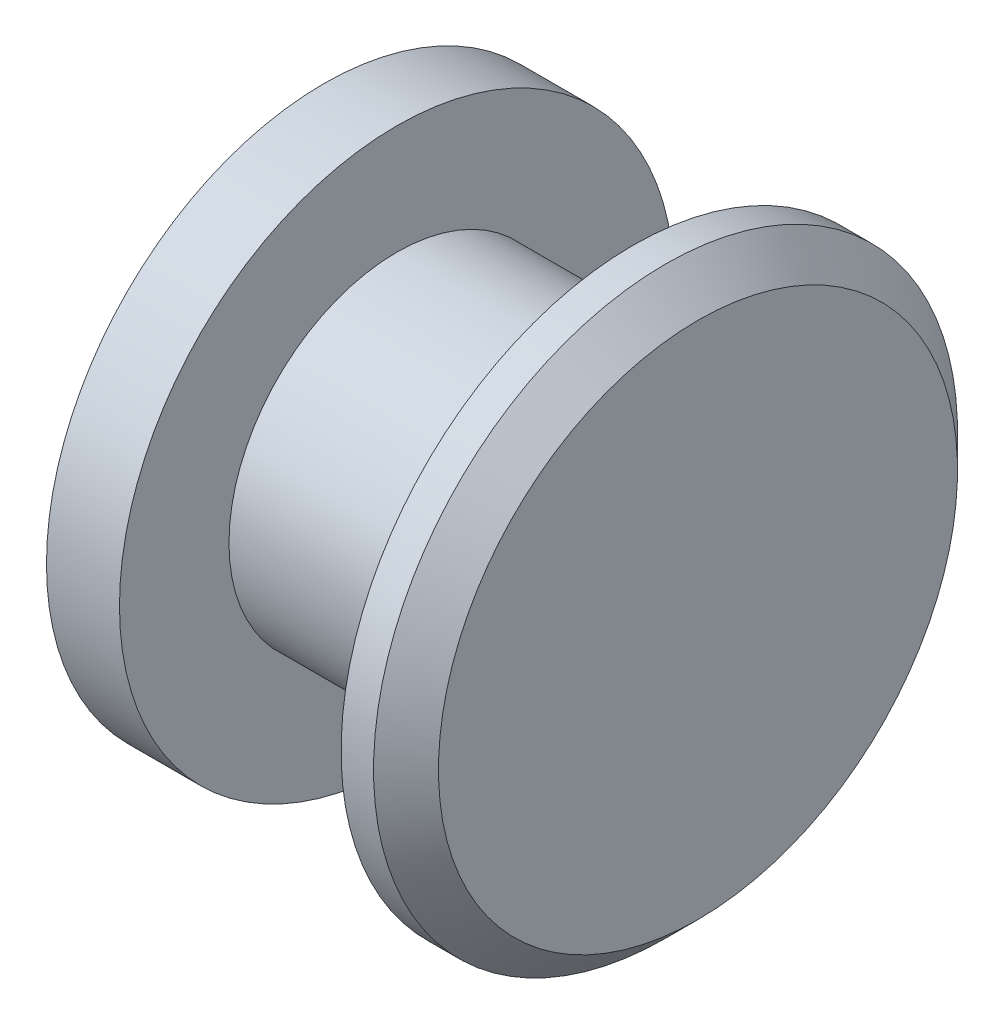
ISO-10303-21;
HEADER;
FILE_DESCRIPTION(('STEP AP214'),'2;1');
FILE_NAME('part.step','',(''),(''),'','','');
FILE_SCHEMA(('AUTOMOTIVE_DESIGN { 1 0 10303 214 1 1 1 1 }'));
ENDSEC;
DATA;
#1=APPLICATION_CONTEXT('core data for automotive mechanical design processes');
#2=APPLICATION_PROTOCOL_DEFINITION('international standard','automotive_design',2000,#1);
#3=PRODUCT_CONTEXT('',#1,'mechanical');
#4=PRODUCT('Part','Part','',(#3));
#5=PRODUCT_RELATED_PRODUCT_CATEGORY('part','',(#4));
#6=PRODUCT_DEFINITION_FORMATION('','',#4);
#7=PRODUCT_DEFINITION_CONTEXT('part definition',#1,'design');
#8=PRODUCT_DEFINITION('design','',#6,#7);
#9=PRODUCT_DEFINITION_SHAPE('','',#8);
#10=(LENGTH_UNIT() NAMED_UNIT(*) SI_UNIT(.MILLI.,.METRE.));
#11=(NAMED_UNIT(*) PLANE_ANGLE_UNIT() SI_UNIT($,.RADIAN.));
#12=(NAMED_UNIT(*) SI_UNIT($,.STERADIAN.) SOLID_ANGLE_UNIT());
#13=UNCERTAINTY_MEASURE_WITH_UNIT(LENGTH_MEASURE(1.E-05),#10,'distance_accuracy_value','');
#14=(GEOMETRIC_REPRESENTATION_CONTEXT(3) GLOBAL_UNCERTAINTY_ASSIGNED_CONTEXT((#13)) GLOBAL_UNIT_ASSIGNED_CONTEXT((#10,
#11,#12)) REPRESENTATION_CONTEXT('',''));
#15=CARTESIAN_POINT('',(0.,0.,0.));
#16=DIRECTION('',(0.,0.,1.));
#17=DIRECTION('',(1.,0.,0.));
#18=AXIS2_PLACEMENT_3D('',#15,#16,#17);
#19=CARTESIAN_POINT('',(-18.,16.,0.));
#20=DIRECTION('',(-1.,0.,0.));
#21=DIRECTION('',(0.,0.,1.));
#22=AXIS2_PLACEMENT_3D('',#19,#20,#21);
#23=PLANE('',#22);
#24=CARTESIAN_POINT('',(-18.,12.,0.));
#25=DIRECTION('',(1.,0.,0.));
#26=DIRECTION('',(0.,0.,-1.));
#27=AXIS2_PLACEMENT_3D('',#24,#25,#26);
#28=CIRCLE('',#27,2.3);
#29=CARTESIAN_POINT('',(-18.,14.3,0.));
#30=VERTEX_POINT('',#29);
#31=CARTESIAN_POINT('',(-18.,9.7,0.));
#32=VERTEX_POINT('',#31);
#33=EDGE_CURVE('E110',#30,#32,#28,.T.);
#34=ORIENTED_EDGE('',*,*,#33,.T.);
#35=CARTESIAN_POINT('',(-18.,12.,0.));
#36=DIRECTION('',(1.,0.,0.));
#37=DIRECTION('',(0.,0.,-1.));
#38=AXIS2_PLACEMENT_3D('',#35,#36,#37);
#39=CIRCLE('',#38,2.3);
#40=EDGE_CURVE('E104',#32,#30,#39,.T.);
#41=ORIENTED_EDGE('',*,*,#40,.T.);
#42=EDGE_LOOP('',(#34,#41));
#43=FACE_BOUND('',#42,.T.);
#44=CARTESIAN_POINT('',(-18.,12.,0.));
#45=DIRECTION('',(1.,0.,0.));
#46=DIRECTION('',(0.,0.,-1.));
#47=AXIS2_PLACEMENT_3D('',#44,#45,#46);
#48=CIRCLE('',#47,4.);
#49=CARTESIAN_POINT('',(-18.,16.,0.));
#50=VERTEX_POINT('',#49);
#51=CARTESIAN_POINT('',(-18.,8.,0.));
#52=VERTEX_POINT('',#51);
#53=EDGE_CURVE('E139',#50,#52,#48,.T.);
#54=ORIENTED_EDGE('',*,*,#53,.F.);
#55=CARTESIAN_POINT('',(-18.,12.,0.));
#56=DIRECTION('',(1.,0.,0.));
#57=DIRECTION('',(0.,0.,-1.));
#58=AXIS2_PLACEMENT_3D('',#55,#56,#57);
#59=CIRCLE('',#58,4.);
#60=EDGE_CURVE('E138',#52,#50,#59,.T.);
#61=ORIENTED_EDGE('',*,*,#60,.F.);
#62=EDGE_LOOP('',(#54,#61));
#63=FACE_BOUND('',#62,.T.);
#64=ADVANCED_FACE('F16',(#43,#63),#23,.T.);
#65=CARTESIAN_POINT('',(-17.1106447673729,14.3,0.));
#66=DIRECTION('',(1.,0.,0.));
#67=DIRECTION('',(0.,1.,0.));
#68=AXIS2_PLACEMENT_3D('',#65,#66,#67);
#69=PLANE('',#68);
#70=CARTESIAN_POINT('',(-17.1106447673729,12.,0.));
#71=DIRECTION('',(1.,0.,0.));
#72=DIRECTION('',(0.,0.,-1.));
#73=AXIS2_PLACEMENT_3D('',#70,#71,#72);
#74=CIRCLE('',#73,3.55532238368643);
#75=CARTESIAN_POINT('',(-17.1106447673729,15.5553223836864,0.));
#76=VERTEX_POINT('',#75);
#77=CARTESIAN_POINT('',(-17.1106447673729,8.44467761631357,0.));
#78=VERTEX_POINT('',#77);
#79=EDGE_CURVE('E142',#76,#78,#74,.T.);
#80=ORIENTED_EDGE('',*,*,#79,.T.);
#81=CARTESIAN_POINT('',(-17.1106447673729,12.,0.));
#82=DIRECTION('',(1.,0.,0.));
#83=DIRECTION('',(0.,0.,-1.));
#84=AXIS2_PLACEMENT_3D('',#81,#82,#83);
#85=CIRCLE('',#84,3.55532238368643);
#86=EDGE_CURVE('E26',#78,#76,#85,.T.);
#87=ORIENTED_EDGE('',*,*,#86,.T.);
#88=EDGE_LOOP('',(#80,#87));
#89=FACE_BOUND('',#88,.T.);
#90=ADVANCED_FACE('F18',(#89),#69,.T.);
#91=CARTESIAN_POINT('',(-17.3329835755296,12.,0.));
#92=DIRECTION('',(-1.,0.,0.));
#93=DIRECTION('',(0.,1.,0.));
#94=AXIS2_PLACEMENT_3D('',#91,#92,#93);
#95=CONICAL_SURFACE('',#94,3.77766119184322,0.785398163397448);
#96=ORIENTED_EDGE('',*,*,#79,.F.);
#97=ORIENTED_EDGE('',*,*,#86,.F.);
#98=DIRECTION('',(-0.707106781186548,-0.707106781186548,0.));
#99=VECTOR('',#98,1.);
#100=CARTESIAN_POINT('',(-17.3329835755296,8.22233880815679,0.));
#101=LINE('',#100,#99);
#102=CARTESIAN_POINT('',(-17.5553223836864,8.,0.));
#103=VERTEX_POINT('',#102);
#104=EDGE_CURVE('E11',#78,#103,#101,.T.);
#105=ORIENTED_EDGE('',*,*,#104,.T.);
#106=CARTESIAN_POINT('',(-17.5553223836864,12.,0.));
#107=DIRECTION('',(1.,0.,0.));
#108=DIRECTION('',(0.,0.,-1.));
#109=AXIS2_PLACEMENT_3D('',#106,#107,#108);
#110=CIRCLE('',#109,4.);
#111=CARTESIAN_POINT('',(-17.5553223836864,16.,0.));
#112=VERTEX_POINT('',#111);
#113=EDGE_CURVE('E125',#103,#112,#110,.T.);
#114=ORIENTED_EDGE('',*,*,#113,.T.);
#115=CARTESIAN_POINT('',(-17.5553223836864,12.,0.));
#116=DIRECTION('',(1.,0.,0.));
#117=DIRECTION('',(0.,0.,-1.));
#118=AXIS2_PLACEMENT_3D('',#115,#116,#117);
#119=CIRCLE('',#118,4.);
#120=EDGE_CURVE('E117',#112,#103,#119,.T.);
#121=ORIENTED_EDGE('',*,*,#120,.T.);
#122=ORIENTED_EDGE('',*,*,#104,.F.);
#123=EDGE_LOOP('',(#96,#97,#105,#114,#121,#122));
#124=FACE_BOUND('',#123,.T.);
#125=ADVANCED_FACE('F158',(#124),#95,.T.);
#126=CARTESIAN_POINT('',(-17.7776611918432,12.,0.));
#127=DIRECTION('',(1.,0.,0.));
#128=DIRECTION('',(0.,1.,0.));
#129=AXIS2_PLACEMENT_3D('',#126,#127,#128);
#130=CYLINDRICAL_SURFACE('',#129,4.);
#131=ORIENTED_EDGE('',*,*,#120,.F.);
#132=ORIENTED_EDGE('',*,*,#113,.F.);
#133=DIRECTION('',(-1.,0.,0.));
#134=VECTOR('',#133,1.);
#135=CARTESIAN_POINT('',(-17.7776611918432,8.,0.));
#136=LINE('',#135,#134);
#137=EDGE_CURVE('E134',#103,#52,#136,.T.);
#138=ORIENTED_EDGE('',*,*,#137,.T.);
#139=ORIENTED_EDGE('',*,*,#60,.T.);
#140=ORIENTED_EDGE('',*,*,#53,.T.);
#141=ORIENTED_EDGE('',*,*,#137,.F.);
#142=EDGE_LOOP('',(#131,#132,#138,#139,#140,#141));
#143=FACE_BOUND('',#142,.T.);
#144=ADVANCED_FACE('F161',(#143),#130,.T.);
#145=CARTESIAN_POINT('',(-21.236,14.3,0.));
#146=DIRECTION('',(1.,0.,0.));
#147=DIRECTION('',(0.,1.,0.));
#148=AXIS2_PLACEMENT_3D('',#145,#146,#147);
#149=PLANE('',#148);
#150=CARTESIAN_POINT('',(-21.236,12.,0.));
#151=DIRECTION('',(1.,0.,0.));
#152=DIRECTION('',(0.,0.,-1.));
#153=AXIS2_PLACEMENT_3D('',#150,#151,#152);
#154=CIRCLE('',#153,2.3);
#155=CARTESIAN_POINT('',(-21.236,14.3,0.));
#156=VERTEX_POINT('',#155);
#157=CARTESIAN_POINT('',(-21.236,9.7,0.));
#158=VERTEX_POINT('',#157);
#159=EDGE_CURVE('E88',#156,#158,#154,.T.);
#160=ORIENTED_EDGE('',*,*,#159,.F.);
#161=CARTESIAN_POINT('',(-21.236,12.,0.));
#162=DIRECTION('',(1.,0.,0.));
#163=DIRECTION('',(0.,0.,-1.));
#164=AXIS2_PLACEMENT_3D('',#161,#162,#163);
#165=CIRCLE('',#164,2.3);
#166=EDGE_CURVE('E95',#158,#156,#165,.T.);
#167=ORIENTED_EDGE('',*,*,#166,.F.);
#168=EDGE_LOOP('',(#160,#167));
#169=FACE_BOUND('',#168,.T.);
#170=CARTESIAN_POINT('',(-21.236,12.,0.));
#171=DIRECTION('',(1.,0.,0.));
#172=DIRECTION('',(0.,0.,-1.));
#173=AXIS2_PLACEMENT_3D('',#170,#171,#172);
#174=CIRCLE('',#173,3.8);
#175=CARTESIAN_POINT('',(-21.236,15.8,0.));
#176=VERTEX_POINT('',#175);
#177=CARTESIAN_POINT('',(-21.236,8.2,0.));
#178=VERTEX_POINT('',#177);
#179=EDGE_CURVE('E128',#176,#178,#174,.T.);
#180=ORIENTED_EDGE('',*,*,#179,.T.);
#181=CARTESIAN_POINT('',(-21.236,12.,0.));
#182=DIRECTION('',(1.,0.,0.));
#183=DIRECTION('',(0.,0.,-1.));
#184=AXIS2_PLACEMENT_3D('',#181,#182,#183);
#185=CIRCLE('',#184,3.8);
#186=EDGE_CURVE('E118',#178,#176,#185,.T.);
#187=ORIENTED_EDGE('',*,*,#186,.T.);
#188=EDGE_LOOP('',(#180,#187));
#189=FACE_BOUND('',#188,.T.);
#190=ADVANCED_FACE('F100',(#169,#189),#149,.T.);
#191=CARTESIAN_POINT('',(-21.736,12.,0.));
#192=DIRECTION('',(1.,0.,0.));
#193=DIRECTION('',(0.,1.,0.));
#194=AXIS2_PLACEMENT_3D('',#191,#192,#193);
#195=CYLINDRICAL_SURFACE('',#194,3.8);
#196=ORIENTED_EDGE('',*,*,#179,.F.);
#197=ORIENTED_EDGE('',*,*,#186,.F.);
#198=DIRECTION('',(-1.,0.,0.));
#199=VECTOR('',#198,1.);
#200=CARTESIAN_POINT('',(-21.736,8.2,0.));
#201=LINE('',#200,#199);
#202=CARTESIAN_POINT('',(-22.236,8.2,0.));
#203=VERTEX_POINT('',#202);
#204=EDGE_CURVE('E114',#178,#203,#201,.T.);
#205=ORIENTED_EDGE('',*,*,#204,.T.);
#206=CARTESIAN_POINT('',(-22.236,12.,0.));
#207=DIRECTION('',(1.,0.,0.));
#208=DIRECTION('',(0.,0.,-1.));
#209=AXIS2_PLACEMENT_3D('',#206,#207,#208);
#210=CIRCLE('',#209,3.8);
#211=CARTESIAN_POINT('',(-22.236,15.8,0.));
#212=VERTEX_POINT('',#211);
#213=EDGE_CURVE('E122',#203,#212,#210,.T.);
#214=ORIENTED_EDGE('',*,*,#213,.T.);
#215=CARTESIAN_POINT('',(-22.236,12.,0.));
#216=DIRECTION('',(1.,0.,0.));
#217=DIRECTION('',(0.,0.,-1.));
#218=AXIS2_PLACEMENT_3D('',#215,#216,#217);
#219=CIRCLE('',#218,3.8);
#220=EDGE_CURVE('E98',#212,#203,#219,.T.);
#221=ORIENTED_EDGE('',*,*,#220,.T.);
#222=ORIENTED_EDGE('',*,*,#204,.F.);
#223=EDGE_LOOP('',(#196,#197,#205,#214,#221,#222));
#224=FACE_BOUND('',#223,.T.);
#225=ADVANCED_FACE('F177',(#224),#195,.T.);
#226=CARTESIAN_POINT('',(-22.236,15.8,0.));
#227=DIRECTION('',(-1.,0.,0.));
#228=DIRECTION('',(0.,0.,1.));
#229=AXIS2_PLACEMENT_3D('',#226,#227,#228);
#230=PLANE('',#229);
#231=ORIENTED_EDGE('',*,*,#220,.F.);
#232=ORIENTED_EDGE('',*,*,#213,.F.);
#233=EDGE_LOOP('',(#231,#232));
#234=FACE_BOUND('',#233,.T.);
#235=ADVANCED_FACE('F180',(#234),#230,.T.);
#236=CARTESIAN_POINT('',(-19.6733223836864,12.,0.));
#237=DIRECTION('',(1.,0.,0.));
#238=DIRECTION('',(0.,1.,0.));
#239=AXIS2_PLACEMENT_3D('',#236,#237,#238);
#240=CYLINDRICAL_SURFACE('',#239,2.3);
#241=ORIENTED_EDGE('',*,*,#33,.F.);
#242=ORIENTED_EDGE('',*,*,#40,.F.);
#243=DIRECTION('',(-1.,0.,0.));
#244=VECTOR('',#243,1.);
#245=CARTESIAN_POINT('',(-19.6733223836864,9.7,0.));
#246=LINE('',#245,#244);
#247=EDGE_CURVE('E93',#32,#158,#246,.T.);
#248=ORIENTED_EDGE('',*,*,#247,.T.);
#249=ORIENTED_EDGE('',*,*,#166,.T.);
#250=ORIENTED_EDGE('',*,*,#159,.T.);
#251=ORIENTED_EDGE('',*,*,#247,.F.);
#252=EDGE_LOOP('',(#241,#242,#248,#249,#250,#251));
#253=FACE_BOUND('',#252,.T.);
#254=ADVANCED_FACE('F91',(#253),#240,.T.);
#255=CLOSED_SHELL('',(#64,#90,#125,#144,#190,#225,#235,#254));
#256=MANIFOLD_SOLID_BREP('B1',#255);
#257=ADVANCED_BREP_SHAPE_REPRESENTATION('',(#18,#256),#14);
#258=SHAPE_DEFINITION_REPRESENTATION(#9,#257);
ENDSEC;
END-ISO-10303-21;
